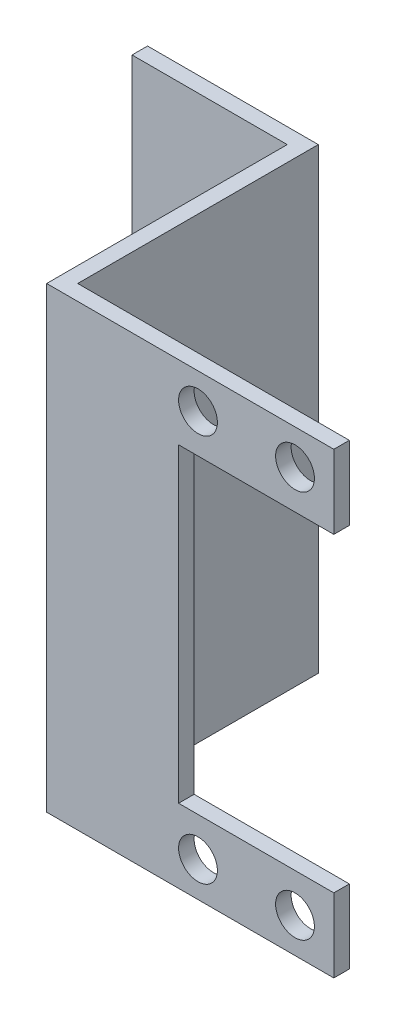
ISO-10303-21;
HEADER;
FILE_DESCRIPTION(('STEP AP214'),'2;1');
FILE_NAME('part.step','',(''),(''),'','','');
FILE_SCHEMA(('AUTOMOTIVE_DESIGN { 1 0 10303 214 1 1 1 1 }'));
ENDSEC;
DATA;
#1=APPLICATION_CONTEXT('core data for automotive mechanical design processes');
#2=APPLICATION_PROTOCOL_DEFINITION('international standard','automotive_design',2000,#1);
#3=PRODUCT_CONTEXT('',#1,'mechanical');
#4=PRODUCT('Part','Part','',(#3));
#5=PRODUCT_RELATED_PRODUCT_CATEGORY('part','',(#4));
#6=PRODUCT_DEFINITION_FORMATION('','',#4);
#7=PRODUCT_DEFINITION_CONTEXT('part definition',#1,'design');
#8=PRODUCT_DEFINITION('design','',#6,#7);
#9=PRODUCT_DEFINITION_SHAPE('','',#8);
#10=(LENGTH_UNIT() NAMED_UNIT(*) SI_UNIT(.MILLI.,.METRE.));
#11=(NAMED_UNIT(*) PLANE_ANGLE_UNIT() SI_UNIT($,.RADIAN.));
#12=(NAMED_UNIT(*) SI_UNIT($,.STERADIAN.) SOLID_ANGLE_UNIT());
#13=UNCERTAINTY_MEASURE_WITH_UNIT(LENGTH_MEASURE(1.E-05),#10,'distance_accuracy_value','');
#14=(GEOMETRIC_REPRESENTATION_CONTEXT(3) GLOBAL_UNCERTAINTY_ASSIGNED_CONTEXT((#13)) GLOBAL_UNIT_ASSIGNED_CONTEXT((#10,
#11,#12)) REPRESENTATION_CONTEXT('',''));
#15=CARTESIAN_POINT('',(0.,0.,0.));
#16=DIRECTION('',(0.,0.,1.));
#17=DIRECTION('',(1.,0.,0.));
#18=AXIS2_PLACEMENT_3D('',#15,#16,#17);
#19=CARTESIAN_POINT('',(0.,0.,2.));
#20=DIRECTION('',(1.,0.,0.));
#21=DIRECTION('',(0.,0.,-1.));
#22=AXIS2_PLACEMENT_3D('',#19,#20,#21);
#23=PLANE('',#22);
#24=DIRECTION('',(0.,1.,0.));
#25=VECTOR('',#24,1.);
#26=CARTESIAN_POINT('',(0.,59.,-29.));
#27=LINE('',#26,#25);
#28=CARTESIAN_POINT('',(0.,0.,-29.));
#29=VERTEX_POINT('',#28);
#30=CARTESIAN_POINT('',(0.,59.,-29.));
#31=VERTEX_POINT('',#30);
#32=EDGE_CURVE('E62',#29,#31,#27,.T.);
#33=ORIENTED_EDGE('',*,*,#32,.F.);
#34=DIRECTION('',(0.,0.,-1.));
#35=VECTOR('',#34,1.);
#36=CARTESIAN_POINT('',(0.,0.,2.));
#37=LINE('',#36,#35);
#38=CARTESIAN_POINT('',(0.,0.,2.));
#39=VERTEX_POINT('',#38);
#40=EDGE_CURVE('E221',#39,#29,#37,.T.);
#41=ORIENTED_EDGE('',*,*,#40,.F.);
#42=DIRECTION('',(0.,-1.,0.));
#43=VECTOR('',#42,1.);
#44=CARTESIAN_POINT('',(0.,0.,2.));
#45=LINE('',#44,#43);
#46=CARTESIAN_POINT('',(0.,59.,2.));
#47=VERTEX_POINT('',#46);
#48=EDGE_CURVE('E219',#47,#39,#45,.T.);
#49=ORIENTED_EDGE('',*,*,#48,.F.);
#50=DIRECTION('',(0.,0.,-1.));
#51=VECTOR('',#50,1.);
#52=CARTESIAN_POINT('',(0.,59.,2.));
#53=LINE('',#52,#51);
#54=EDGE_CURVE('E229',#47,#31,#53,.T.);
#55=ORIENTED_EDGE('',*,*,#54,.T.);
#56=EDGE_LOOP('',(#33,#41,#49,#55));
#57=FACE_BOUND('',#56,.T.);
#58=ADVANCED_FACE('F45',(#57),#23,.F.);
#59=CARTESIAN_POINT('',(37.,59.,2.));
#60=DIRECTION('',(-1.,0.,0.));
#61=DIRECTION('',(0.,0.,1.));
#62=AXIS2_PLACEMENT_3D('',#59,#60,#61);
#63=PLANE('',#62);
#64=DIRECTION('',(0.,1.,0.));
#65=VECTOR('',#64,1.);
#66=CARTESIAN_POINT('',(37.,59.,0.));
#67=LINE('',#66,#65);
#68=CARTESIAN_POINT('',(37.,0.,0.));
#69=VERTEX_POINT('',#68);
#70=CARTESIAN_POINT('',(37.,9.5,0.));
#71=VERTEX_POINT('',#70);
#72=EDGE_CURVE('E224',#69,#71,#67,.T.);
#73=ORIENTED_EDGE('',*,*,#72,.T.);
#74=DIRECTION('',(0.,0.,1.));
#75=VECTOR('',#74,1.);
#76=CARTESIAN_POINT('',(37.,9.5,0.));
#77=LINE('',#76,#75);
#78=CARTESIAN_POINT('',(37.,9.5,2.));
#79=VERTEX_POINT('',#78);
#80=EDGE_CURVE('E200',#71,#79,#77,.T.);
#81=ORIENTED_EDGE('',*,*,#80,.T.);
#82=DIRECTION('',(0.,1.,0.));
#83=VECTOR('',#82,1.);
#84=CARTESIAN_POINT('',(37.,59.,2.));
#85=LINE('',#84,#83);
#86=CARTESIAN_POINT('',(37.,0.,2.));
#87=VERTEX_POINT('',#86);
#88=EDGE_CURVE('E214',#87,#79,#85,.T.);
#89=ORIENTED_EDGE('',*,*,#88,.F.);
#90=DIRECTION('',(0.,0.,-1.));
#91=VECTOR('',#90,1.);
#92=CARTESIAN_POINT('',(37.,0.,2.));
#93=LINE('',#92,#91);
#94=EDGE_CURVE('E11',#87,#69,#93,.T.);
#95=ORIENTED_EDGE('',*,*,#94,.T.);
#96=EDGE_LOOP('',(#73,#81,#89,#95));
#97=FACE_BOUND('',#96,.T.);
#98=ADVANCED_FACE('F297',(#97),#63,.F.);
#99=CARTESIAN_POINT('',(37.,0.,2.));
#100=DIRECTION('',(0.,1.,0.));
#101=DIRECTION('',(0.,0.,1.));
#102=AXIS2_PLACEMENT_3D('',#99,#100,#101);
#103=PLANE('',#102);
#104=ORIENTED_EDGE('',*,*,#40,.T.);
#105=DIRECTION('',(1.,0.,0.));
#106=VECTOR('',#105,1.);
#107=CARTESIAN_POINT('',(-20.,0.,-29.));
#108=LINE('',#107,#106);
#109=CARTESIAN_POINT('',(-20.,0.,-29.));
#110=VERTEX_POINT('',#109);
#111=EDGE_CURVE('E153',#110,#29,#108,.T.);
#112=ORIENTED_EDGE('',*,*,#111,.F.);
#113=DIRECTION('',(0.,0.,1.));
#114=VECTOR('',#113,1.);
#115=CARTESIAN_POINT('',(-20.,0.,-31.));
#116=LINE('',#115,#114);
#117=CARTESIAN_POINT('',(-20.,0.,-31.));
#118=VERTEX_POINT('',#117);
#119=EDGE_CURVE('E151',#118,#110,#116,.T.);
#120=ORIENTED_EDGE('',*,*,#119,.F.);
#121=DIRECTION('',(-1.,0.,0.));
#122=VECTOR('',#121,1.);
#123=CARTESIAN_POINT('',(0.,0.,-31.));
#124=LINE('',#123,#122);
#125=CARTESIAN_POINT('',(1.99999999999999,0.,-31.));
#126=VERTEX_POINT('',#125);
#127=EDGE_CURVE('E138',#126,#118,#124,.T.);
#128=ORIENTED_EDGE('',*,*,#127,.F.);
#129=DIRECTION('',(0.,0.,1.));
#130=VECTOR('',#129,1.);
#131=CARTESIAN_POINT('',(1.99999999999999,0.,-31.));
#132=LINE('',#131,#130);
#133=CARTESIAN_POINT('',(1.99999999999999,0.,0.));
#134=VERTEX_POINT('',#133);
#135=EDGE_CURVE('E148',#126,#134,#132,.T.);
#136=ORIENTED_EDGE('',*,*,#135,.T.);
#137=DIRECTION('',(1.,0.,0.));
#138=VECTOR('',#137,1.);
#139=CARTESIAN_POINT('',(37.,0.,0.));
#140=LINE('',#139,#138);
#141=EDGE_CURVE('E203',#134,#69,#140,.T.);
#142=ORIENTED_EDGE('',*,*,#141,.T.);
#143=ORIENTED_EDGE('',*,*,#94,.F.);
#144=DIRECTION('',(1.,0.,0.));
#145=VECTOR('',#144,1.);
#146=CARTESIAN_POINT('',(37.,0.,2.));
#147=LINE('',#146,#145);
#148=EDGE_CURVE('E209',#39,#87,#147,.T.);
#149=ORIENTED_EDGE('',*,*,#148,.F.);
#150=EDGE_LOOP('',(#104,#112,#120,#128,#136,#142,#143,#149));
#151=FACE_BOUND('',#150,.T.);
#152=ADVANCED_FACE('F47',(#151),#103,.F.);
#153=CARTESIAN_POINT('',(37.,49.5,2.));
#154=VERTEX_POINT('',#153);
#155=CARTESIAN_POINT('',(37.,59.,2.));
#156=VERTEX_POINT('',#155);
#157=EDGE_CURVE('E212',#154,#156,#85,.T.);
#158=ORIENTED_EDGE('',*,*,#157,.F.);
#159=DIRECTION('',(0.,0.,1.));
#160=VECTOR('',#159,1.);
#161=CARTESIAN_POINT('',(37.,49.5,0.));
#162=LINE('',#161,#160);
#163=CARTESIAN_POINT('',(37.,49.5,0.));
#164=VERTEX_POINT('',#163);
#165=EDGE_CURVE('E193',#164,#154,#162,.T.);
#166=ORIENTED_EDGE('',*,*,#165,.F.);
#167=CARTESIAN_POINT('',(37.,59.,0.));
#168=VERTEX_POINT('',#167);
#169=EDGE_CURVE('E223',#164,#168,#67,.T.);
#170=ORIENTED_EDGE('',*,*,#169,.T.);
#171=DIRECTION('',(0.,0.,-1.));
#172=VECTOR('',#171,1.);
#173=CARTESIAN_POINT('',(37.,59.,2.));
#174=LINE('',#173,#172);
#175=EDGE_CURVE('E54',#156,#168,#174,.T.);
#176=ORIENTED_EDGE('',*,*,#175,.F.);
#177=EDGE_LOOP('',(#158,#166,#170,#176));
#178=FACE_BOUND('',#177,.T.);
#179=ADVANCED_FACE('F312',(#178),#63,.F.);
#180=CARTESIAN_POINT('',(0.,59.,2.));
#181=DIRECTION('',(0.,-1.,0.));
#182=DIRECTION('',(0.,0.,-1.));
#183=AXIS2_PLACEMENT_3D('',#180,#181,#182);
#184=PLANE('',#183);
#185=DIRECTION('',(-1.,0.,0.));
#186=VECTOR('',#185,1.);
#187=CARTESIAN_POINT('',(0.,59.,0.));
#188=LINE('',#187,#186);
#189=CARTESIAN_POINT('',(2.,59.,0.));
#190=VERTEX_POINT('',#189);
#191=EDGE_CURVE('E213',#168,#190,#188,.T.);
#192=ORIENTED_EDGE('',*,*,#191,.T.);
#193=DIRECTION('',(0.,0.,1.));
#194=VECTOR('',#193,1.);
#195=CARTESIAN_POINT('',(2.,59.,-31.));
#196=LINE('',#195,#194);
#197=CARTESIAN_POINT('',(2.,59.,-31.));
#198=VERTEX_POINT('',#197);
#199=EDGE_CURVE('E179',#198,#190,#196,.T.);
#200=ORIENTED_EDGE('',*,*,#199,.F.);
#201=DIRECTION('',(1.,0.,0.));
#202=VECTOR('',#201,1.);
#203=CARTESIAN_POINT('',(0.,59.,-31.));
#204=LINE('',#203,#202);
#205=CARTESIAN_POINT('',(-20.,59.,-31.));
#206=VERTEX_POINT('',#205);
#207=EDGE_CURVE('E174',#206,#198,#204,.T.);
#208=ORIENTED_EDGE('',*,*,#207,.F.);
#209=DIRECTION('',(0.,0.,-1.));
#210=VECTOR('',#209,1.);
#211=CARTESIAN_POINT('',(-20.,59.,-31.));
#212=LINE('',#211,#210);
#213=CARTESIAN_POINT('',(-20.,59.,-29.));
#214=VERTEX_POINT('',#213);
#215=EDGE_CURVE('E161',#214,#206,#212,.T.);
#216=ORIENTED_EDGE('',*,*,#215,.F.);
#217=DIRECTION('',(1.,0.,0.));
#218=VECTOR('',#217,1.);
#219=CARTESIAN_POINT('',(-20.,59.,-29.));
#220=LINE('',#219,#218);
#221=EDGE_CURVE('E169',#214,#31,#220,.T.);
#222=ORIENTED_EDGE('',*,*,#221,.T.);
#223=ORIENTED_EDGE('',*,*,#54,.F.);
#224=DIRECTION('',(-1.,0.,0.));
#225=VECTOR('',#224,1.);
#226=CARTESIAN_POINT('',(0.,59.,2.));
#227=LINE('',#226,#225);
#228=EDGE_CURVE('E217',#156,#47,#227,.T.);
#229=ORIENTED_EDGE('',*,*,#228,.F.);
#230=ORIENTED_EDGE('',*,*,#175,.T.);
#231=EDGE_LOOP('',(#192,#200,#208,#216,#222,#223,#229,#230));
#232=FACE_BOUND('',#231,.T.);
#233=ADVANCED_FACE('F289',(#232),#184,.F.);
#234=CARTESIAN_POINT('',(0.,0.,2.));
#235=DIRECTION('',(0.,0.,-1.));
#236=DIRECTION('',(-1.,0.,0.));
#237=AXIS2_PLACEMENT_3D('',#234,#235,#236);
#238=PLANE('',#237);
#239=CARTESIAN_POINT('',(32.,4.49999999999998,2.));
#240=DIRECTION('',(0.,0.,-1.));
#241=DIRECTION('',(-1.,0.,0.));
#242=AXIS2_PLACEMENT_3D('',#239,#240,#241);
#243=CIRCLE('',#242,2.5);
#244=CARTESIAN_POINT('',(29.5,4.49999999999998,2.));
#245=VERTEX_POINT('',#244);
#246=EDGE_CURVE('E242',#245,#245,#243,.T.);
#247=ORIENTED_EDGE('',*,*,#246,.T.);
#248=EDGE_LOOP('',(#247));
#249=FACE_BOUND('',#248,.T.);
#250=CARTESIAN_POINT('',(19.5,4.49999999999999,2.));
#251=DIRECTION('',(0.,0.,-1.));
#252=DIRECTION('',(-1.,0.,0.));
#253=AXIS2_PLACEMENT_3D('',#250,#251,#252);
#254=CIRCLE('',#253,2.5);
#255=CARTESIAN_POINT('',(17.,4.49999999999999,2.));
#256=VERTEX_POINT('',#255);
#257=EDGE_CURVE('E246',#256,#256,#254,.T.);
#258=ORIENTED_EDGE('',*,*,#257,.T.);
#259=EDGE_LOOP('',(#258));
#260=FACE_BOUND('',#259,.T.);
#261=CARTESIAN_POINT('',(19.5,54.5,2.));
#262=DIRECTION('',(0.,0.,-1.));
#263=DIRECTION('',(-1.,0.,0.));
#264=AXIS2_PLACEMENT_3D('',#261,#262,#263);
#265=CIRCLE('',#264,2.5);
#266=CARTESIAN_POINT('',(17.,54.5,2.));
#267=VERTEX_POINT('',#266);
#268=EDGE_CURVE('E249',#267,#267,#265,.T.);
#269=ORIENTED_EDGE('',*,*,#268,.T.);
#270=EDGE_LOOP('',(#269));
#271=FACE_BOUND('',#270,.T.);
#272=CARTESIAN_POINT('',(32.,54.5,2.));
#273=DIRECTION('',(0.,0.,-1.));
#274=DIRECTION('',(-1.,0.,0.));
#275=AXIS2_PLACEMENT_3D('',#272,#273,#274);
#276=CIRCLE('',#275,2.5);
#277=CARTESIAN_POINT('',(29.5,54.5,2.));
#278=VERTEX_POINT('',#277);
#279=EDGE_CURVE('E252',#278,#278,#276,.T.);
#280=ORIENTED_EDGE('',*,*,#279,.T.);
#281=EDGE_LOOP('',(#280));
#282=FACE_BOUND('',#281,.T.);
#283=ORIENTED_EDGE('',*,*,#88,.T.);
#284=DIRECTION('',(1.,0.,0.));
#285=VECTOR('',#284,1.);
#286=CARTESIAN_POINT('',(17.,9.49999999999999,2.));
#287=LINE('',#286,#285);
#288=CARTESIAN_POINT('',(17.,9.49999999999999,2.));
#289=VERTEX_POINT('',#288);
#290=EDGE_CURVE('E187',#289,#79,#287,.T.);
#291=ORIENTED_EDGE('',*,*,#290,.F.);
#292=DIRECTION('',(0.,-1.,0.));
#293=VECTOR('',#292,1.);
#294=CARTESIAN_POINT('',(17.,49.5,2.));
#295=LINE('',#294,#293);
#296=CARTESIAN_POINT('',(17.,49.5,2.));
#297=VERTEX_POINT('',#296);
#298=EDGE_CURVE('E196',#297,#289,#295,.T.);
#299=ORIENTED_EDGE('',*,*,#298,.F.);
#300=DIRECTION('',(-1.,0.,0.));
#301=VECTOR('',#300,1.);
#302=CARTESIAN_POINT('',(37.,49.5,2.));
#303=LINE('',#302,#301);
#304=EDGE_CURVE('E182',#154,#297,#303,.T.);
#305=ORIENTED_EDGE('',*,*,#304,.F.);
#306=ORIENTED_EDGE('',*,*,#157,.T.);
#307=ORIENTED_EDGE('',*,*,#228,.T.);
#308=ORIENTED_EDGE('',*,*,#48,.T.);
#309=ORIENTED_EDGE('',*,*,#148,.T.);
#310=EDGE_LOOP('',(#283,#291,#299,#305,#306,#307,#308,#309));
#311=FACE_BOUND('',#310,.T.);
#312=ADVANCED_FACE('F275',(#249,#260,#271,#282,#311),#238,.F.);
#313=CARTESIAN_POINT('',(0.,0.,0.));
#314=DIRECTION('',(0.,0.,-1.));
#315=DIRECTION('',(-1.,0.,0.));
#316=AXIS2_PLACEMENT_3D('',#313,#314,#315);
#317=PLANE('',#316);
#318=CARTESIAN_POINT('',(32.,4.49999999999998,0.));
#319=DIRECTION('',(0.,0.,-1.));
#320=DIRECTION('',(1.,0.,0.));
#321=AXIS2_PLACEMENT_3D('',#318,#319,#320);
#322=CIRCLE('',#321,2.5);
#323=CARTESIAN_POINT('',(34.5,4.49999999999998,0.));
#324=VERTEX_POINT('',#323);
#325=EDGE_CURVE('E259',#324,#324,#322,.T.);
#326=ORIENTED_EDGE('',*,*,#325,.F.);
#327=EDGE_LOOP('',(#326));
#328=FACE_BOUND('',#327,.T.);
#329=CARTESIAN_POINT('',(19.5,4.49999999999999,0.));
#330=DIRECTION('',(0.,0.,-1.));
#331=DIRECTION('',(1.,0.,0.));
#332=AXIS2_PLACEMENT_3D('',#329,#330,#331);
#333=CIRCLE('',#332,2.5);
#334=CARTESIAN_POINT('',(22.,4.49999999999999,0.));
#335=VERTEX_POINT('',#334);
#336=EDGE_CURVE('E262',#335,#335,#333,.T.);
#337=ORIENTED_EDGE('',*,*,#336,.F.);
#338=EDGE_LOOP('',(#337));
#339=FACE_BOUND('',#338,.T.);
#340=CARTESIAN_POINT('',(19.5,54.5,0.));
#341=DIRECTION('',(0.,0.,-1.));
#342=DIRECTION('',(-1.,0.,0.));
#343=AXIS2_PLACEMENT_3D('',#340,#341,#342);
#344=CIRCLE('',#343,2.5);
#345=CARTESIAN_POINT('',(17.,54.5,0.));
#346=VERTEX_POINT('',#345);
#347=EDGE_CURVE('E258',#346,#346,#344,.T.);
#348=ORIENTED_EDGE('',*,*,#347,.F.);
#349=EDGE_LOOP('',(#348));
#350=FACE_BOUND('',#349,.T.);
#351=CARTESIAN_POINT('',(32.,54.5,0.));
#352=DIRECTION('',(0.,0.,-1.));
#353=DIRECTION('',(-1.,0.,0.));
#354=AXIS2_PLACEMENT_3D('',#351,#352,#353);
#355=CIRCLE('',#354,2.5);
#356=CARTESIAN_POINT('',(29.5,54.5,0.));
#357=VERTEX_POINT('',#356);
#358=EDGE_CURVE('E255',#357,#357,#355,.T.);
#359=ORIENTED_EDGE('',*,*,#358,.F.);
#360=EDGE_LOOP('',(#359));
#361=FACE_BOUND('',#360,.T.);
#362=DIRECTION('',(0.,-1.,0.));
#363=VECTOR('',#362,1.);
#364=CARTESIAN_POINT('',(2.,59.,0.));
#365=LINE('',#364,#363);
#366=EDGE_CURVE('E70',#190,#134,#365,.T.);
#367=ORIENTED_EDGE('',*,*,#366,.F.);
#368=ORIENTED_EDGE('',*,*,#191,.F.);
#369=ORIENTED_EDGE('',*,*,#169,.F.);
#370=DIRECTION('',(-1.,0.,0.));
#371=VECTOR('',#370,1.);
#372=CARTESIAN_POINT('',(37.,49.5,0.));
#373=LINE('',#372,#371);
#374=CARTESIAN_POINT('',(17.,49.5,0.));
#375=VERTEX_POINT('',#374);
#376=EDGE_CURVE('E183',#164,#375,#373,.T.);
#377=ORIENTED_EDGE('',*,*,#376,.T.);
#378=DIRECTION('',(0.,-1.,0.));
#379=VECTOR('',#378,1.);
#380=CARTESIAN_POINT('',(17.,49.5,0.));
#381=LINE('',#380,#379);
#382=CARTESIAN_POINT('',(17.,9.49999999999999,0.));
#383=VERTEX_POINT('',#382);
#384=EDGE_CURVE('E186',#375,#383,#381,.T.);
#385=ORIENTED_EDGE('',*,*,#384,.T.);
#386=DIRECTION('',(1.,0.,0.));
#387=VECTOR('',#386,1.);
#388=CARTESIAN_POINT('',(17.,9.49999999999999,0.));
#389=LINE('',#388,#387);
#390=EDGE_CURVE('E190',#383,#71,#389,.T.);
#391=ORIENTED_EDGE('',*,*,#390,.T.);
#392=ORIENTED_EDGE('',*,*,#72,.F.);
#393=ORIENTED_EDGE('',*,*,#141,.F.);
#394=EDGE_LOOP('',(#367,#368,#369,#377,#385,#391,#392,#393));
#395=FACE_BOUND('',#394,.T.);
#396=ADVANCED_FACE('F271',(#328,#339,#350,#361,#395),#317,.T.);
#397=CARTESIAN_POINT('',(17.,9.49999999999999,0.));
#398=DIRECTION('',(0.,-1.,0.));
#399=DIRECTION('',(1.,0.,0.));
#400=AXIS2_PLACEMENT_3D('',#397,#398,#399);
#401=PLANE('',#400);
#402=ORIENTED_EDGE('',*,*,#290,.T.);
#403=ORIENTED_EDGE('',*,*,#80,.F.);
#404=ORIENTED_EDGE('',*,*,#390,.F.);
#405=DIRECTION('',(0.,0.,1.));
#406=VECTOR('',#405,1.);
#407=CARTESIAN_POINT('',(17.,9.49999999999999,0.));
#408=LINE('',#407,#406);
#409=EDGE_CURVE('E204',#383,#289,#408,.T.);
#410=ORIENTED_EDGE('',*,*,#409,.T.);
#411=EDGE_LOOP('',(#402,#403,#404,#410));
#412=FACE_BOUND('',#411,.T.);
#413=ADVANCED_FACE('F274',(#412),#401,.F.);
#414=CARTESIAN_POINT('',(17.,49.5,0.));
#415=DIRECTION('',(-1.,0.,0.));
#416=DIRECTION('',(0.,-1.,0.));
#417=AXIS2_PLACEMENT_3D('',#414,#415,#416);
#418=PLANE('',#417);
#419=ORIENTED_EDGE('',*,*,#298,.T.);
#420=ORIENTED_EDGE('',*,*,#409,.F.);
#421=ORIENTED_EDGE('',*,*,#384,.F.);
#422=DIRECTION('',(0.,0.,1.));
#423=VECTOR('',#422,1.);
#424=CARTESIAN_POINT('',(17.,49.5,0.));
#425=LINE('',#424,#423);
#426=EDGE_CURVE('E206',#375,#297,#425,.T.);
#427=ORIENTED_EDGE('',*,*,#426,.T.);
#428=EDGE_LOOP('',(#419,#420,#421,#427));
#429=FACE_BOUND('',#428,.T.);
#430=ADVANCED_FACE('F304',(#429),#418,.F.);
#431=CARTESIAN_POINT('',(37.,49.5,0.));
#432=DIRECTION('',(0.,1.,0.));
#433=DIRECTION('',(0.,0.,1.));
#434=AXIS2_PLACEMENT_3D('',#431,#432,#433);
#435=PLANE('',#434);
#436=ORIENTED_EDGE('',*,*,#304,.T.);
#437=ORIENTED_EDGE('',*,*,#426,.F.);
#438=ORIENTED_EDGE('',*,*,#376,.F.);
#439=ORIENTED_EDGE('',*,*,#165,.T.);
#440=EDGE_LOOP('',(#436,#437,#438,#439));
#441=FACE_BOUND('',#440,.T.);
#442=ADVANCED_FACE('F306',(#441),#435,.F.);
#443=CARTESIAN_POINT('',(2.,59.,-31.));
#444=DIRECTION('',(-1.,0.,0.));
#445=DIRECTION('',(0.,-1.,0.));
#446=AXIS2_PLACEMENT_3D('',#443,#444,#445);
#447=PLANE('',#446);
#448=ORIENTED_EDGE('',*,*,#366,.T.);
#449=ORIENTED_EDGE('',*,*,#135,.F.);
#450=DIRECTION('',(0.,-1.,0.));
#451=VECTOR('',#450,1.);
#452=CARTESIAN_POINT('',(2.,59.,-31.));
#453=LINE('',#452,#451);
#454=EDGE_CURVE('E144',#198,#126,#453,.T.);
#455=ORIENTED_EDGE('',*,*,#454,.F.);
#456=ORIENTED_EDGE('',*,*,#199,.T.);
#457=EDGE_LOOP('',(#448,#449,#455,#456));
#458=FACE_BOUND('',#457,.T.);
#459=ADVANCED_FACE('F318',(#458),#447,.F.);
#460=CARTESIAN_POINT('',(0.,0.,-31.));
#461=DIRECTION('',(0.,0.,1.));
#462=DIRECTION('',(1.,0.,0.));
#463=AXIS2_PLACEMENT_3D('',#460,#461,#462);
#464=PLANE('',#463);
#465=CARTESIAN_POINT('',(-9.99999999999999,44.5,-31.));
#466=DIRECTION('',(0.,0.,-1.));
#467=DIRECTION('',(-1.,0.,0.));
#468=AXIS2_PLACEMENT_3D('',#465,#466,#467);
#469=CIRCLE('',#468,2.);
#470=CARTESIAN_POINT('',(-12.,44.5,-31.));
#471=VERTEX_POINT('',#470);
#472=EDGE_CURVE('E234',#471,#471,#469,.T.);
#473=ORIENTED_EDGE('',*,*,#472,.F.);
#474=EDGE_LOOP('',(#473));
#475=FACE_BOUND('',#474,.T.);
#476=CARTESIAN_POINT('',(-10.,14.5,-31.));
#477=DIRECTION('',(0.,0.,-1.));
#478=DIRECTION('',(-1.,0.,0.));
#479=AXIS2_PLACEMENT_3D('',#476,#477,#478);
#480=CIRCLE('',#479,2.);
#481=CARTESIAN_POINT('',(-12.,14.5,-31.));
#482=VERTEX_POINT('',#481);
#483=EDGE_CURVE('E165',#482,#482,#480,.T.);
#484=ORIENTED_EDGE('',*,*,#483,.F.);
#485=EDGE_LOOP('',(#484));
#486=FACE_BOUND('',#485,.T.);
#487=ORIENTED_EDGE('',*,*,#127,.T.);
#488=DIRECTION('',(0.,-1.,0.));
#489=VECTOR('',#488,1.);
#490=CARTESIAN_POINT('',(-20.,59.,-31.));
#491=LINE('',#490,#489);
#492=EDGE_CURVE('E142',#206,#118,#491,.T.);
#493=ORIENTED_EDGE('',*,*,#492,.F.);
#494=ORIENTED_EDGE('',*,*,#207,.T.);
#495=ORIENTED_EDGE('',*,*,#454,.T.);
#496=EDGE_LOOP('',(#487,#493,#494,#495));
#497=FACE_BOUND('',#496,.T.);
#498=ADVANCED_FACE('F140',(#475,#486,#497),#464,.F.);
#499=CARTESIAN_POINT('',(-20.,59.,-29.));
#500=DIRECTION('',(0.,0.,-1.));
#501=DIRECTION('',(0.,1.,0.));
#502=AXIS2_PLACEMENT_3D('',#499,#500,#501);
#503=PLANE('',#502);
#504=CARTESIAN_POINT('',(-9.99999999999999,44.5,-29.));
#505=DIRECTION('',(0.,0.,-1.));
#506=DIRECTION('',(0.,1.,0.));
#507=AXIS2_PLACEMENT_3D('',#504,#505,#506);
#508=CIRCLE('',#507,2.);
#509=CARTESIAN_POINT('',(-9.99999999999999,46.5,-29.));
#510=VERTEX_POINT('',#509);
#511=EDGE_CURVE('E49',#510,#510,#508,.T.);
#512=ORIENTED_EDGE('',*,*,#511,.T.);
#513=EDGE_LOOP('',(#512));
#514=FACE_BOUND('',#513,.T.);
#515=CARTESIAN_POINT('',(-10.,14.5,-29.));
#516=DIRECTION('',(0.,0.,-1.));
#517=DIRECTION('',(0.,1.,0.));
#518=AXIS2_PLACEMENT_3D('',#515,#516,#517);
#519=CIRCLE('',#518,2.);
#520=CARTESIAN_POINT('',(-10.,16.5,-29.));
#521=VERTEX_POINT('',#520);
#522=EDGE_CURVE('E232',#521,#521,#519,.T.);
#523=ORIENTED_EDGE('',*,*,#522,.T.);
#524=EDGE_LOOP('',(#523));
#525=FACE_BOUND('',#524,.T.);
#526=ORIENTED_EDGE('',*,*,#32,.T.);
#527=ORIENTED_EDGE('',*,*,#221,.F.);
#528=DIRECTION('',(0.,1.,0.));
#529=VECTOR('',#528,1.);
#530=CARTESIAN_POINT('',(-20.,59.,-29.));
#531=LINE('',#530,#529);
#532=EDGE_CURVE('E156',#110,#214,#531,.T.);
#533=ORIENTED_EDGE('',*,*,#532,.F.);
#534=ORIENTED_EDGE('',*,*,#111,.T.);
#535=EDGE_LOOP('',(#526,#527,#533,#534));
#536=FACE_BOUND('',#535,.T.);
#537=ADVANCED_FACE('F322',(#514,#525,#536),#503,.F.);
#538=CARTESIAN_POINT('',(-20.,0.,0.));
#539=DIRECTION('',(-1.,0.,0.));
#540=DIRECTION('',(0.,0.,1.));
#541=AXIS2_PLACEMENT_3D('',#538,#539,#540);
#542=PLANE('',#541);
#543=ORIENTED_EDGE('',*,*,#492,.T.);
#544=ORIENTED_EDGE('',*,*,#119,.T.);
#545=ORIENTED_EDGE('',*,*,#532,.T.);
#546=ORIENTED_EDGE('',*,*,#215,.T.);
#547=EDGE_LOOP('',(#543,#544,#545,#546));
#548=FACE_BOUND('',#547,.T.);
#549=ADVANCED_FACE('F159',(#548),#542,.T.);
#550=CARTESIAN_POINT('',(-10.,14.5,-11.));
#551=DIRECTION('',(0.,0.,-1.));
#552=DIRECTION('',(-1.,0.,0.));
#553=AXIS2_PLACEMENT_3D('',#550,#551,#552);
#554=CYLINDRICAL_SURFACE('',#553,2.);
#555=ORIENTED_EDGE('',*,*,#483,.T.);
#556=EDGE_LOOP('',(#555));
#557=FACE_BOUND('',#556,.T.);
#558=ORIENTED_EDGE('',*,*,#522,.F.);
#559=EDGE_LOOP('',(#558));
#560=FACE_BOUND('',#559,.T.);
#561=ADVANCED_FACE('F331',(#557,#560),#554,.F.);
#562=CARTESIAN_POINT('',(-9.99999999999999,44.5,-11.));
#563=DIRECTION('',(0.,0.,-1.));
#564=DIRECTION('',(-1.,0.,0.));
#565=AXIS2_PLACEMENT_3D('',#562,#563,#564);
#566=CYLINDRICAL_SURFACE('',#565,2.);
#567=ORIENTED_EDGE('',*,*,#472,.T.);
#568=EDGE_LOOP('',(#567));
#569=FACE_BOUND('',#568,.T.);
#570=ORIENTED_EDGE('',*,*,#511,.F.);
#571=EDGE_LOOP('',(#570));
#572=FACE_BOUND('',#571,.T.);
#573=ADVANCED_FACE('F283',(#569,#572),#566,.F.);
#574=CARTESIAN_POINT('',(32.,54.5,20.));
#575=DIRECTION('',(0.,0.,-1.));
#576=DIRECTION('',(-1.,0.,0.));
#577=AXIS2_PLACEMENT_3D('',#574,#575,#576);
#578=CYLINDRICAL_SURFACE('',#577,2.5);
#579=ORIENTED_EDGE('',*,*,#358,.T.);
#580=EDGE_LOOP('',(#579));
#581=FACE_BOUND('',#580,.T.);
#582=ORIENTED_EDGE('',*,*,#279,.F.);
#583=EDGE_LOOP('',(#582));
#584=FACE_BOUND('',#583,.T.);
#585=ADVANCED_FACE('F280',(#581,#584),#578,.F.);
#586=CARTESIAN_POINT('',(19.5,54.5,20.));
#587=DIRECTION('',(0.,0.,-1.));
#588=DIRECTION('',(-1.,0.,0.));
#589=AXIS2_PLACEMENT_3D('',#586,#587,#588);
#590=CYLINDRICAL_SURFACE('',#589,2.5);
#591=ORIENTED_EDGE('',*,*,#347,.T.);
#592=EDGE_LOOP('',(#591));
#593=FACE_BOUND('',#592,.T.);
#594=ORIENTED_EDGE('',*,*,#268,.F.);
#595=EDGE_LOOP('',(#594));
#596=FACE_BOUND('',#595,.T.);
#597=ADVANCED_FACE('F268',(#593,#596),#590,.F.);
#598=CARTESIAN_POINT('',(19.5,4.49999999999999,20.));
#599=DIRECTION('',(0.,0.,-1.));
#600=DIRECTION('',(-1.,0.,0.));
#601=AXIS2_PLACEMENT_3D('',#598,#599,#600);
#602=CYLINDRICAL_SURFACE('',#601,2.5);
#603=ORIENTED_EDGE('',*,*,#336,.T.);
#604=EDGE_LOOP('',(#603));
#605=FACE_BOUND('',#604,.T.);
#606=ORIENTED_EDGE('',*,*,#257,.F.);
#607=EDGE_LOOP('',(#606));
#608=FACE_BOUND('',#607,.T.);
#609=ADVANCED_FACE('F404',(#605,#608),#602,.F.);
#610=CARTESIAN_POINT('',(32.,4.49999999999998,20.));
#611=DIRECTION('',(0.,0.,-1.));
#612=DIRECTION('',(-1.,0.,0.));
#613=AXIS2_PLACEMENT_3D('',#610,#611,#612);
#614=CYLINDRICAL_SURFACE('',#613,2.5);
#615=ORIENTED_EDGE('',*,*,#325,.T.);
#616=EDGE_LOOP('',(#615));
#617=FACE_BOUND('',#616,.T.);
#618=ORIENTED_EDGE('',*,*,#246,.F.);
#619=EDGE_LOOP('',(#618));
#620=FACE_BOUND('',#619,.T.);
#621=ADVANCED_FACE('F412',(#617,#620),#614,.F.);
#622=CLOSED_SHELL('',(#58,#98,#152,#179,#233,#312,#396,#413,#430,#442,#459,#498,#537,#549,#561,
#573,#585,#597,#609,#621));
#623=MANIFOLD_SOLID_BREP('B2',#622);
#624=ADVANCED_BREP_SHAPE_REPRESENTATION('',(#18,#623),#14);
#625=SHAPE_DEFINITION_REPRESENTATION(#9,#624);
ENDSEC;
END-ISO-10303-21;
